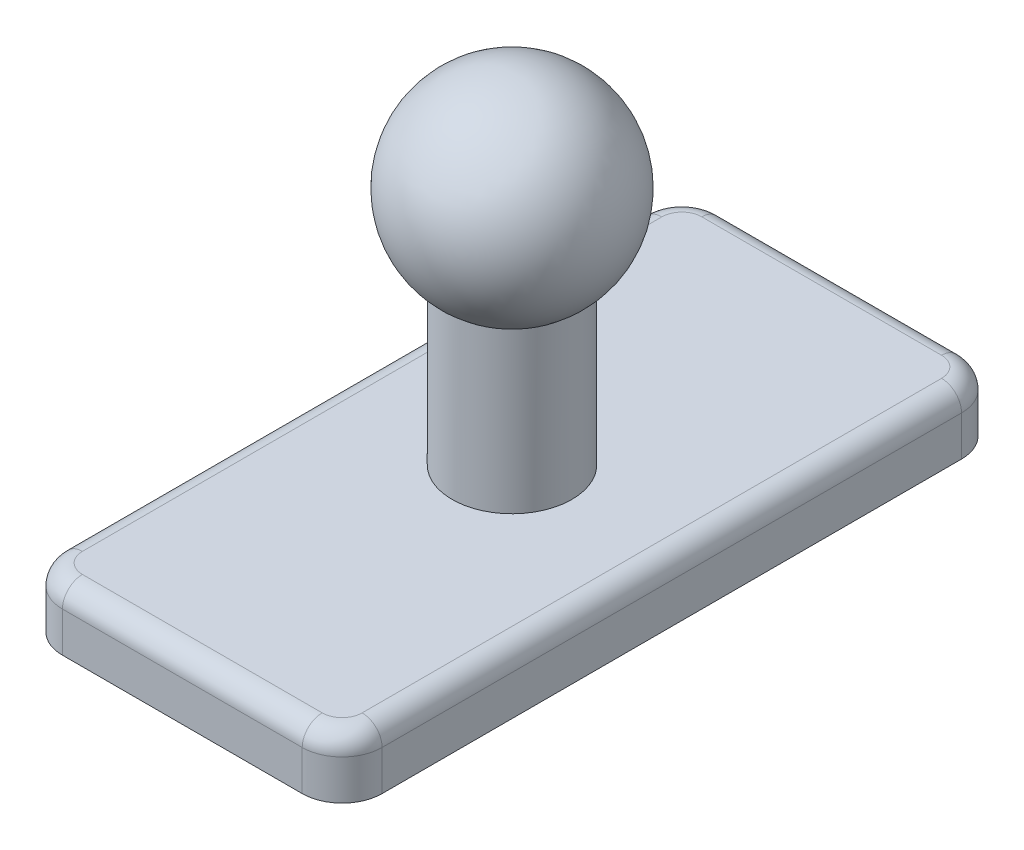
ISO-10303-21;
HEADER;
FILE_DESCRIPTION(('STEP AP214'),'2;1');
FILE_NAME('part.step','',(''),(''),'','','');
FILE_SCHEMA(('AUTOMOTIVE_DESIGN { 1 0 10303 214 1 1 1 1 }'));
ENDSEC;
DATA;
#1=APPLICATION_CONTEXT('core data for automotive mechanical design processes');
#2=APPLICATION_PROTOCOL_DEFINITION('international standard','automotive_design',2000,#1);
#3=PRODUCT_CONTEXT('',#1,'mechanical');
#4=PRODUCT('Part','Part','',(#3));
#5=PRODUCT_RELATED_PRODUCT_CATEGORY('part','',(#4));
#6=PRODUCT_DEFINITION_FORMATION('','',#4);
#7=PRODUCT_DEFINITION_CONTEXT('part definition',#1,'design');
#8=PRODUCT_DEFINITION('design','',#6,#7);
#9=PRODUCT_DEFINITION_SHAPE('','',#8);
#10=(LENGTH_UNIT() NAMED_UNIT(*) SI_UNIT(.MILLI.,.METRE.));
#11=(NAMED_UNIT(*) PLANE_ANGLE_UNIT() SI_UNIT($,.RADIAN.));
#12=(NAMED_UNIT(*) SI_UNIT($,.STERADIAN.) SOLID_ANGLE_UNIT());
#13=UNCERTAINTY_MEASURE_WITH_UNIT(LENGTH_MEASURE(1.E-05),#10,'distance_accuracy_value','');
#14=(GEOMETRIC_REPRESENTATION_CONTEXT(3) GLOBAL_UNCERTAINTY_ASSIGNED_CONTEXT((#13)) GLOBAL_UNIT_ASSIGNED_CONTEXT((#10,
#11,#12)) REPRESENTATION_CONTEXT('',''));
#15=CARTESIAN_POINT('',(0.,0.,0.));
#16=DIRECTION('',(0.,0.,1.));
#17=DIRECTION('',(1.,0.,0.));
#18=AXIS2_PLACEMENT_3D('',#15,#16,#17);
#19=CARTESIAN_POINT('',(-7.28498397727274,15.,21.5783811363636));
#20=DIRECTION('',(0.,-1.,0.));
#21=DIRECTION('',(0.,0.,-1.));
#22=AXIS2_PLACEMENT_3D('',#19,#20,#21);
#23=CYLINDRICAL_SURFACE('',#22,3.);
#24=CARTESIAN_POINT('',(-7.28498397727274,3.,21.5783811363636));
#25=DIRECTION('',(0.,-1.,0.));
#26=DIRECTION('',(0.,0.,-1.));
#27=AXIS2_PLACEMENT_3D('',#24,#25,#26);
#28=CIRCLE('',#27,3.);
#29=CARTESIAN_POINT('',(-7.28498397727274,3.,18.5783811363636));
#30=VERTEX_POINT('',#29);
#31=EDGE_CURVE('E44',#30,#30,#28,.F.);
#32=ORIENTED_EDGE('',*,*,#31,.T.);
#33=EDGE_LOOP('',(#32));
#34=FACE_BOUND('',#33,.T.);
#35=CARTESIAN_POINT('',(-7.28498397727274,11.,21.5783811363636));
#36=DIRECTION('',(0.,1.,0.));
#37=DIRECTION('',(0.,0.,1.));
#38=AXIS2_PLACEMENT_3D('',#35,#36,#37);
#39=CIRCLE('',#38,3.);
#40=CARTESIAN_POINT('',(-7.28498397727274,11.,24.5783811363636));
#41=VERTEX_POINT('',#40);
#42=EDGE_CURVE('E11',#41,#41,#39,.T.);
#43=ORIENTED_EDGE('',*,*,#42,.F.);
#44=EDGE_LOOP('',(#43));
#45=FACE_BOUND('',#44,.T.);
#46=ADVANCED_FACE('F35',(#34,#45),#23,.T.);
#47=CARTESIAN_POINT('',(-1.28498397727274,3.,7.07838113636365));
#48=DIRECTION('',(0.,-1.,0.));
#49=DIRECTION('',(0.,0.,-1.));
#50=AXIS2_PLACEMENT_3D('',#47,#48,#49);
#51=PLANE('',#50);
#52=DIRECTION('',(-1.,0.,0.));
#53=VECTOR('',#52,1.);
#54=CARTESIAN_POINT('',(-1.28498397727274,3.,6.07838113636365));
#55=LINE('',#54,#53);
#56=CARTESIAN_POINT('',(-1.28498397727276,3.,6.07838113636365));
#57=VERTEX_POINT('',#56);
#58=CARTESIAN_POINT('',(-13.2849839772727,3.,6.07838113636365));
#59=VERTEX_POINT('',#58);
#60=EDGE_CURVE('E199',#57,#59,#55,.T.);
#61=ORIENTED_EDGE('',*,*,#60,.T.);
#62=CARTESIAN_POINT('',(-13.2849839772727,3.,7.07838113636365));
#63=DIRECTION('',(0.,-1.,0.));
#64=DIRECTION('',(0.,0.,-1.));
#65=AXIS2_PLACEMENT_3D('',#62,#63,#64);
#66=CIRCLE('',#65,1.);
#67=CARTESIAN_POINT('',(-14.2849839772727,3.,7.07838113636366));
#68=VERTEX_POINT('',#67);
#69=EDGE_CURVE('E201',#59,#68,#66,.F.);
#70=ORIENTED_EDGE('',*,*,#69,.T.);
#71=DIRECTION('',(0.,0.,1.));
#72=VECTOR('',#71,1.);
#73=CARTESIAN_POINT('',(-14.2849839772727,3.,7.07838113636365));
#74=LINE('',#73,#72);
#75=CARTESIAN_POINT('',(-14.2849839772727,3.,36.0783811363636));
#76=VERTEX_POINT('',#75);
#77=EDGE_CURVE('E137',#68,#76,#74,.T.);
#78=ORIENTED_EDGE('',*,*,#77,.T.);
#79=CARTESIAN_POINT('',(-13.2849839772727,3.,36.0783811363636));
#80=DIRECTION('',(0.,-1.,0.));
#81=DIRECTION('',(0.,0.,-1.));
#82=AXIS2_PLACEMENT_3D('',#79,#80,#81);
#83=CIRCLE('',#82,1.);
#84=CARTESIAN_POINT('',(-13.2849839772727,3.,37.0783811363637));
#85=VERTEX_POINT('',#84);
#86=EDGE_CURVE('E189',#76,#85,#83,.F.);
#87=ORIENTED_EDGE('',*,*,#86,.T.);
#88=DIRECTION('',(1.,0.,0.));
#89=VECTOR('',#88,1.);
#90=CARTESIAN_POINT('',(-1.28498397727274,3.,37.0783811363637));
#91=LINE('',#90,#89);
#92=CARTESIAN_POINT('',(-1.28498397727273,3.,37.0783811363637));
#93=VERTEX_POINT('',#92);
#94=EDGE_CURVE('E191',#85,#93,#91,.T.);
#95=ORIENTED_EDGE('',*,*,#94,.T.);
#96=CARTESIAN_POINT('',(-1.28498397727272,3.,36.0783811363636));
#97=DIRECTION('',(0.,-1.,0.));
#98=DIRECTION('',(0.,0.,-1.));
#99=AXIS2_PLACEMENT_3D('',#96,#97,#98);
#100=CIRCLE('',#99,1.);
#101=CARTESIAN_POINT('',(-0.284983977272723,3.,36.0783811363636));
#102=VERTEX_POINT('',#101);
#103=EDGE_CURVE('E193',#93,#102,#100,.F.);
#104=ORIENTED_EDGE('',*,*,#103,.T.);
#105=DIRECTION('',(0.,0.,-1.));
#106=VECTOR('',#105,1.);
#107=CARTESIAN_POINT('',(-0.284983977272742,3.,7.07838113636365));
#108=LINE('',#107,#106);
#109=CARTESIAN_POINT('',(-0.284983977272742,3.,7.07838113636366));
#110=VERTEX_POINT('',#109);
#111=EDGE_CURVE('E195',#102,#110,#108,.T.);
#112=ORIENTED_EDGE('',*,*,#111,.T.);
#113=CARTESIAN_POINT('',(-1.28498397727274,3.,7.07838113636365));
#114=DIRECTION('',(0.,-1.,0.));
#115=DIRECTION('',(0.,0.,-1.));
#116=AXIS2_PLACEMENT_3D('',#113,#114,#115);
#117=CIRCLE('',#116,1.);
#118=EDGE_CURVE('E197',#110,#57,#117,.F.);
#119=ORIENTED_EDGE('',*,*,#118,.T.);
#120=EDGE_LOOP('',(#61,#70,#78,#87,#95,#104,#112,#119));
#121=FACE_BOUND('',#120,.T.);
#122=ORIENTED_EDGE('',*,*,#31,.F.);
#123=EDGE_LOOP('',(#122));
#124=FACE_BOUND('',#123,.T.);
#125=ADVANCED_FACE('F240',(#121,#124),#51,.F.);
#126=CARTESIAN_POINT('',(-1.28498397727274,3.,7.07838113636365));
#127=DIRECTION('',(0.,-1.,0.));
#128=DIRECTION('',(0.,0.,-1.));
#129=AXIS2_PLACEMENT_3D('',#126,#127,#128);
#130=CYLINDRICAL_SURFACE('',#129,2.);
#131=DIRECTION('',(0.,-1.,0.));
#132=VECTOR('',#131,1.);
#133=CARTESIAN_POINT('',(-1.28498397727276,3.,5.07838113636365));
#134=LINE('',#133,#132);
#135=CARTESIAN_POINT('',(-1.28498397727276,2.,5.07838113636365));
#136=VERTEX_POINT('',#135);
#137=CARTESIAN_POINT('',(-1.28498397727276,0.,5.07838113636365));
#138=VERTEX_POINT('',#137);
#139=EDGE_CURVE('E126',#136,#138,#134,.T.);
#140=ORIENTED_EDGE('',*,*,#139,.F.);
#141=CARTESIAN_POINT('',(-1.28498397727274,2.,7.07838113636365));
#142=DIRECTION('',(0.,-1.,0.));
#143=DIRECTION('',(0.,0.,-1.));
#144=AXIS2_PLACEMENT_3D('',#141,#142,#143);
#145=CIRCLE('',#144,2.);
#146=CARTESIAN_POINT('',(0.715016022727258,2.,7.07838113636366));
#147=VERTEX_POINT('',#146);
#148=EDGE_CURVE('E208',#136,#147,#145,.T.);
#149=ORIENTED_EDGE('',*,*,#148,.T.);
#150=DIRECTION('',(0.,-1.,0.));
#151=VECTOR('',#150,1.);
#152=CARTESIAN_POINT('',(0.715016022727258,3.,7.07838113636366));
#153=LINE('',#152,#151);
#154=CARTESIAN_POINT('',(0.715016022727258,0.,7.07838113636366));
#155=VERTEX_POINT('',#154);
#156=EDGE_CURVE('E151',#147,#155,#153,.T.);
#157=ORIENTED_EDGE('',*,*,#156,.T.);
#158=CARTESIAN_POINT('',(-1.28498397727274,0.,7.07838113636365));
#159=DIRECTION('',(0.,1.,0.));
#160=DIRECTION('',(0.,0.,-1.));
#161=AXIS2_PLACEMENT_3D('',#158,#159,#160);
#162=CIRCLE('',#161,2.);
#163=EDGE_CURVE('E144',#155,#138,#162,.T.);
#164=ORIENTED_EDGE('',*,*,#163,.T.);
#165=EDGE_LOOP('',(#140,#149,#157,#164));
#166=FACE_BOUND('',#165,.T.);
#167=ADVANCED_FACE('F149',(#166),#130,.T.);
#168=CARTESIAN_POINT('',(-13.2849839772727,3.,5.07838113636365));
#169=DIRECTION('',(0.,0.,1.));
#170=DIRECTION('',(1.,0.,0.));
#171=AXIS2_PLACEMENT_3D('',#168,#169,#170);
#172=PLANE('',#171);
#173=DIRECTION('',(0.,-1.,0.));
#174=VECTOR('',#173,1.);
#175=CARTESIAN_POINT('',(-13.2849839772727,3.,5.07838113636365));
#176=LINE('',#175,#174);
#177=CARTESIAN_POINT('',(-13.2849839772727,2.,5.07838113636365));
#178=VERTEX_POINT('',#177);
#179=CARTESIAN_POINT('',(-13.2849839772727,0.,5.07838113636365));
#180=VERTEX_POINT('',#179);
#181=EDGE_CURVE('E138',#178,#180,#176,.T.);
#182=ORIENTED_EDGE('',*,*,#181,.F.);
#183=DIRECTION('',(-1.,0.,0.));
#184=VECTOR('',#183,1.);
#185=CARTESIAN_POINT('',(-13.2849839772727,2.,5.07838113636365));
#186=LINE('',#185,#184);
#187=EDGE_CURVE('E133',#178,#136,#186,.F.);
#188=ORIENTED_EDGE('',*,*,#187,.T.);
#189=ORIENTED_EDGE('',*,*,#139,.T.);
#190=DIRECTION('',(-1.,0.,0.));
#191=VECTOR('',#190,1.);
#192=CARTESIAN_POINT('',(-13.2849839772727,0.,5.07838113636365));
#193=LINE('',#192,#191);
#194=EDGE_CURVE('E130',#138,#180,#193,.T.);
#195=ORIENTED_EDGE('',*,*,#194,.T.);
#196=EDGE_LOOP('',(#182,#188,#189,#195));
#197=FACE_BOUND('',#196,.T.);
#198=ADVANCED_FACE('F129',(#197),#172,.F.);
#199=CARTESIAN_POINT('',(-13.2849839772727,3.,7.07838113636365));
#200=DIRECTION('',(0.,-1.,0.));
#201=DIRECTION('',(0.,0.,-1.));
#202=AXIS2_PLACEMENT_3D('',#199,#200,#201);
#203=CYLINDRICAL_SURFACE('',#202,2.);
#204=DIRECTION('',(0.,-1.,0.));
#205=VECTOR('',#204,1.);
#206=CARTESIAN_POINT('',(-15.2849839772727,3.,7.07838113636366));
#207=LINE('',#206,#205);
#208=CARTESIAN_POINT('',(-15.2849839772727,2.,7.07838113636366));
#209=VERTEX_POINT('',#208);
#210=CARTESIAN_POINT('',(-15.2849839772727,0.,7.07838113636366));
#211=VERTEX_POINT('',#210);
#212=EDGE_CURVE('E185',#209,#211,#207,.T.);
#213=ORIENTED_EDGE('',*,*,#212,.F.);
#214=CARTESIAN_POINT('',(-13.2849839772727,2.,7.07838113636365));
#215=DIRECTION('',(0.,-1.,0.));
#216=DIRECTION('',(0.,0.,-1.));
#217=AXIS2_PLACEMENT_3D('',#214,#215,#216);
#218=CIRCLE('',#217,2.);
#219=EDGE_CURVE('E204',#209,#178,#218,.T.);
#220=ORIENTED_EDGE('',*,*,#219,.T.);
#221=ORIENTED_EDGE('',*,*,#181,.T.);
#222=CARTESIAN_POINT('',(-13.2849839772727,0.,7.07838113636365));
#223=DIRECTION('',(0.,1.,0.));
#224=DIRECTION('',(0.,0.,1.));
#225=AXIS2_PLACEMENT_3D('',#222,#223,#224);
#226=CIRCLE('',#225,2.);
#227=EDGE_CURVE('E147',#180,#211,#226,.T.);
#228=ORIENTED_EDGE('',*,*,#227,.T.);
#229=EDGE_LOOP('',(#213,#220,#221,#228));
#230=FACE_BOUND('',#229,.T.);
#231=ADVANCED_FACE('F271',(#230),#203,.T.);
#232=CARTESIAN_POINT('',(-15.2849839772727,3.,7.07838113636366));
#233=DIRECTION('',(1.,0.,0.));
#234=DIRECTION('',(0.,0.,-1.));
#235=AXIS2_PLACEMENT_3D('',#232,#233,#234);
#236=PLANE('',#235);
#237=DIRECTION('',(0.,-1.,0.));
#238=VECTOR('',#237,1.);
#239=CARTESIAN_POINT('',(-15.2849839772727,3.,36.0783811363636));
#240=LINE('',#239,#238);
#241=CARTESIAN_POINT('',(-15.2849839772727,2.,36.0783811363636));
#242=VERTEX_POINT('',#241);
#243=CARTESIAN_POINT('',(-15.2849839772727,0.,36.0783811363636));
#244=VERTEX_POINT('',#243);
#245=EDGE_CURVE('E183',#242,#244,#240,.T.);
#246=ORIENTED_EDGE('',*,*,#245,.F.);
#247=DIRECTION('',(0.,0.,1.));
#248=VECTOR('',#247,1.);
#249=CARTESIAN_POINT('',(-15.2849839772727,2.,7.07838113636366));
#250=LINE('',#249,#248);
#251=EDGE_CURVE('E216',#242,#209,#250,.F.);
#252=ORIENTED_EDGE('',*,*,#251,.T.);
#253=ORIENTED_EDGE('',*,*,#212,.T.);
#254=DIRECTION('',(0.,0.,1.));
#255=VECTOR('',#254,1.);
#256=CARTESIAN_POINT('',(-15.2849839772727,0.,7.07838113636366));
#257=LINE('',#256,#255);
#258=EDGE_CURVE('E162',#211,#244,#257,.T.);
#259=ORIENTED_EDGE('',*,*,#258,.T.);
#260=EDGE_LOOP('',(#246,#252,#253,#259));
#261=FACE_BOUND('',#260,.T.);
#262=ADVANCED_FACE('F268',(#261),#236,.F.);
#263=CARTESIAN_POINT('',(-13.2849839772727,3.,36.0783811363636));
#264=DIRECTION('',(0.,-1.,0.));
#265=DIRECTION('',(0.,0.,-1.));
#266=AXIS2_PLACEMENT_3D('',#263,#264,#265);
#267=CYLINDRICAL_SURFACE('',#266,2.);
#268=DIRECTION('',(0.,-1.,0.));
#269=VECTOR('',#268,1.);
#270=CARTESIAN_POINT('',(-13.2849839772727,3.,38.0783811363637));
#271=LINE('',#270,#269);
#272=CARTESIAN_POINT('',(-13.2849839772727,2.,38.0783811363637));
#273=VERTEX_POINT('',#272);
#274=CARTESIAN_POINT('',(-13.2849839772727,0.,38.0783811363637));
#275=VERTEX_POINT('',#274);
#276=EDGE_CURVE('E181',#273,#275,#271,.T.);
#277=ORIENTED_EDGE('',*,*,#276,.F.);
#278=CARTESIAN_POINT('',(-13.2849839772727,2.,36.0783811363636));
#279=DIRECTION('',(0.,-1.,0.));
#280=DIRECTION('',(0.,0.,-1.));
#281=AXIS2_PLACEMENT_3D('',#278,#279,#280);
#282=CIRCLE('',#281,2.);
#283=EDGE_CURVE('E51',#273,#242,#282,.T.);
#284=ORIENTED_EDGE('',*,*,#283,.T.);
#285=ORIENTED_EDGE('',*,*,#245,.T.);
#286=CARTESIAN_POINT('',(-13.2849839772727,0.,36.0783811363636));
#287=DIRECTION('',(0.,1.,0.));
#288=DIRECTION('',(0.,0.,1.));
#289=AXIS2_PLACEMENT_3D('',#286,#287,#288);
#290=CIRCLE('',#289,2.);
#291=EDGE_CURVE('E165',#244,#275,#290,.T.);
#292=ORIENTED_EDGE('',*,*,#291,.T.);
#293=EDGE_LOOP('',(#277,#284,#285,#292));
#294=FACE_BOUND('',#293,.T.);
#295=ADVANCED_FACE('F265',(#294),#267,.T.);
#296=CARTESIAN_POINT('',(-13.2849839772727,3.,38.0783811363637));
#297=DIRECTION('',(0.,0.,-1.));
#298=DIRECTION('',(-1.,0.,0.));
#299=AXIS2_PLACEMENT_3D('',#296,#297,#298);
#300=PLANE('',#299);
#301=DIRECTION('',(0.,-1.,0.));
#302=VECTOR('',#301,1.);
#303=CARTESIAN_POINT('',(-1.28498397727274,3.,38.0783811363637));
#304=LINE('',#303,#302);
#305=CARTESIAN_POINT('',(-1.28498397727274,2.,38.0783811363637));
#306=VERTEX_POINT('',#305);
#307=CARTESIAN_POINT('',(-1.28498397727274,0.,38.0783811363637));
#308=VERTEX_POINT('',#307);
#309=EDGE_CURVE('E179',#306,#308,#304,.T.);
#310=ORIENTED_EDGE('',*,*,#309,.F.);
#311=DIRECTION('',(1.,0.,0.));
#312=VECTOR('',#311,1.);
#313=CARTESIAN_POINT('',(-13.2849839772727,2.,38.0783811363637));
#314=LINE('',#313,#312);
#315=EDGE_CURVE('E59',#306,#273,#314,.F.);
#316=ORIENTED_EDGE('',*,*,#315,.T.);
#317=ORIENTED_EDGE('',*,*,#276,.T.);
#318=DIRECTION('',(1.,0.,0.));
#319=VECTOR('',#318,1.);
#320=CARTESIAN_POINT('',(-13.2849839772727,0.,38.0783811363637));
#321=LINE('',#320,#319);
#322=EDGE_CURVE('E168',#275,#308,#321,.T.);
#323=ORIENTED_EDGE('',*,*,#322,.T.);
#324=EDGE_LOOP('',(#310,#316,#317,#323));
#325=FACE_BOUND('',#324,.T.);
#326=ADVANCED_FACE('F261',(#325),#300,.F.);
#327=CARTESIAN_POINT('',(-1.28498397727272,3.,36.0783811363636));
#328=DIRECTION('',(0.,-1.,0.));
#329=DIRECTION('',(0.,0.,-1.));
#330=AXIS2_PLACEMENT_3D('',#327,#328,#329);
#331=CYLINDRICAL_SURFACE('',#330,2.);
#332=DIRECTION('',(0.,-1.,0.));
#333=VECTOR('',#332,1.);
#334=CARTESIAN_POINT('',(0.715016022727277,3.,36.0783811363636));
#335=LINE('',#334,#333);
#336=CARTESIAN_POINT('',(0.715016022727277,2.,36.0783811363636));
#337=VERTEX_POINT('',#336);
#338=CARTESIAN_POINT('',(0.715016022727277,0.,36.0783811363636));
#339=VERTEX_POINT('',#338);
#340=EDGE_CURVE('E177',#337,#339,#335,.T.);
#341=ORIENTED_EDGE('',*,*,#340,.F.);
#342=CARTESIAN_POINT('',(-1.28498397727272,2.,36.0783811363636));
#343=DIRECTION('',(0.,-1.,0.));
#344=DIRECTION('',(0.,0.,-1.));
#345=AXIS2_PLACEMENT_3D('',#342,#343,#344);
#346=CIRCLE('',#345,2.);
#347=EDGE_CURVE('E212',#337,#306,#346,.T.);
#348=ORIENTED_EDGE('',*,*,#347,.T.);
#349=ORIENTED_EDGE('',*,*,#309,.T.);
#350=CARTESIAN_POINT('',(-1.28498397727272,0.,36.0783811363636));
#351=DIRECTION('',(0.,1.,0.));
#352=DIRECTION('',(0.,0.,1.));
#353=AXIS2_PLACEMENT_3D('',#350,#351,#352);
#354=CIRCLE('',#353,2.);
#355=EDGE_CURVE('E171',#308,#339,#354,.T.);
#356=ORIENTED_EDGE('',*,*,#355,.T.);
#357=EDGE_LOOP('',(#341,#348,#349,#356));
#358=FACE_BOUND('',#357,.T.);
#359=ADVANCED_FACE('F257',(#358),#331,.T.);
#360=CARTESIAN_POINT('',(0.715016022727258,3.,7.07838113636366));
#361=DIRECTION('',(-1.,0.,0.));
#362=DIRECTION('',(0.,0.,1.));
#363=AXIS2_PLACEMENT_3D('',#360,#361,#362);
#364=PLANE('',#363);
#365=ORIENTED_EDGE('',*,*,#156,.F.);
#366=DIRECTION('',(0.,0.,-1.));
#367=VECTOR('',#366,1.);
#368=CARTESIAN_POINT('',(0.715016022727258,2.,7.07838113636366));
#369=LINE('',#368,#367);
#370=EDGE_CURVE('E210',#147,#337,#369,.F.);
#371=ORIENTED_EDGE('',*,*,#370,.T.);
#372=ORIENTED_EDGE('',*,*,#340,.T.);
#373=DIRECTION('',(0.,0.,-1.));
#374=VECTOR('',#373,1.);
#375=CARTESIAN_POINT('',(0.715016022727258,0.,7.07838113636366));
#376=LINE('',#375,#374);
#377=EDGE_CURVE('E174',#339,#155,#376,.T.);
#378=ORIENTED_EDGE('',*,*,#377,.T.);
#379=EDGE_LOOP('',(#365,#371,#372,#378));
#380=FACE_BOUND('',#379,.T.);
#381=ADVANCED_FACE('F254',(#380),#364,.F.);
#382=CARTESIAN_POINT('',(-1.28498397727274,0.,7.07838113636365));
#383=DIRECTION('',(0.,-1.,0.));
#384=DIRECTION('',(0.,0.,-1.));
#385=AXIS2_PLACEMENT_3D('',#382,#383,#384);
#386=PLANE('',#385);
#387=ORIENTED_EDGE('',*,*,#163,.F.);
#388=ORIENTED_EDGE('',*,*,#377,.F.);
#389=ORIENTED_EDGE('',*,*,#355,.F.);
#390=ORIENTED_EDGE('',*,*,#322,.F.);
#391=ORIENTED_EDGE('',*,*,#291,.F.);
#392=ORIENTED_EDGE('',*,*,#258,.F.);
#393=ORIENTED_EDGE('',*,*,#227,.F.);
#394=ORIENTED_EDGE('',*,*,#194,.F.);
#395=EDGE_LOOP('',(#387,#388,#389,#390,#391,#392,#393,#394));
#396=FACE_BOUND('',#395,.T.);
#397=ADVANCED_FACE('F142',(#396),#386,.T.);
#398=CARTESIAN_POINT('',(-1.28498397727272,2.,36.0783811363636));
#399=DIRECTION('',(0.,-1.,0.));
#400=DIRECTION('',(0.,0.,-1.));
#401=AXIS2_PLACEMENT_3D('',#398,#399,#400);
#402=TOROIDAL_SURFACE('',#401,1.,1.);
#403=CARTESIAN_POINT('',(-1.28498397727273,2.,37.0783811363637));
#404=DIRECTION('',(-1.,0.,0.));
#405=DIRECTION('',(0.,0.,1.));
#406=AXIS2_PLACEMENT_3D('',#403,#404,#405);
#407=CIRCLE('',#406,1.);
#408=EDGE_CURVE('E156',#306,#93,#407,.T.);
#409=ORIENTED_EDGE('',*,*,#408,.F.);
#410=ORIENTED_EDGE('',*,*,#347,.F.);
#411=CARTESIAN_POINT('',(-0.284983977272723,2.,36.0783811363636));
#412=DIRECTION('',(0.,0.,-1.));
#413=DIRECTION('',(-1.,0.,0.));
#414=AXIS2_PLACEMENT_3D('',#411,#412,#413);
#415=CIRCLE('',#414,1.);
#416=EDGE_CURVE('E153',#102,#337,#415,.T.);
#417=ORIENTED_EDGE('',*,*,#416,.F.);
#418=ORIENTED_EDGE('',*,*,#103,.F.);
#419=EDGE_LOOP('',(#409,#410,#417,#418));
#420=FACE_BOUND('',#419,.T.);
#421=ADVANCED_FACE('F37',(#420),#402,.T.);
#422=CARTESIAN_POINT('',(-0.284983977272742,2.,7.07838113636365));
#423=DIRECTION('',(0.,0.,-1.));
#424=DIRECTION('',(-1.,0.,0.));
#425=AXIS2_PLACEMENT_3D('',#422,#423,#424);
#426=CYLINDRICAL_SURFACE('',#425,1.);
#427=ORIENTED_EDGE('',*,*,#416,.T.);
#428=ORIENTED_EDGE('',*,*,#370,.F.);
#429=CARTESIAN_POINT('',(-0.284983977272742,2.,7.07838113636366));
#430=DIRECTION('',(0.,0.,-1.));
#431=DIRECTION('',(-1.,0.,0.));
#432=AXIS2_PLACEMENT_3D('',#429,#430,#431);
#433=CIRCLE('',#432,1.);
#434=EDGE_CURVE('E231',#110,#147,#433,.T.);
#435=ORIENTED_EDGE('',*,*,#434,.F.);
#436=ORIENTED_EDGE('',*,*,#111,.F.);
#437=EDGE_LOOP('',(#427,#428,#435,#436));
#438=FACE_BOUND('',#437,.T.);
#439=ADVANCED_FACE('F301',(#438),#426,.T.);
#440=CARTESIAN_POINT('',(-1.28498397727274,2.,37.0783811363637));
#441=DIRECTION('',(1.,0.,0.));
#442=DIRECTION('',(0.,0.,-1.));
#443=AXIS2_PLACEMENT_3D('',#440,#441,#442);
#444=CYLINDRICAL_SURFACE('',#443,1.);
#445=ORIENTED_EDGE('',*,*,#408,.T.);
#446=ORIENTED_EDGE('',*,*,#94,.F.);
#447=CARTESIAN_POINT('',(-13.2849839772727,2.,37.0783811363637));
#448=DIRECTION('',(-1.,0.,0.));
#449=DIRECTION('',(0.,0.,1.));
#450=AXIS2_PLACEMENT_3D('',#447,#448,#449);
#451=CIRCLE('',#450,1.);
#452=EDGE_CURVE('E228',#273,#85,#451,.T.);
#453=ORIENTED_EDGE('',*,*,#452,.F.);
#454=ORIENTED_EDGE('',*,*,#315,.F.);
#455=EDGE_LOOP('',(#445,#446,#453,#454));
#456=FACE_BOUND('',#455,.T.);
#457=ADVANCED_FACE('F298',(#456),#444,.T.);
#458=CARTESIAN_POINT('',(-1.28498397727274,2.,7.07838113636365));
#459=DIRECTION('',(0.,-1.,0.));
#460=DIRECTION('',(0.,0.,-1.));
#461=AXIS2_PLACEMENT_3D('',#458,#459,#460);
#462=DEGENERATE_TOROIDAL_SURFACE('',#461,1.,1.,.T.);
#463=ORIENTED_EDGE('',*,*,#434,.T.);
#464=ORIENTED_EDGE('',*,*,#148,.F.);
#465=CARTESIAN_POINT('',(-1.28498397727276,2.,6.07838113636365));
#466=DIRECTION('',(-1.,0.,0.));
#467=DIRECTION('',(0.,0.,1.));
#468=AXIS2_PLACEMENT_3D('',#465,#466,#467);
#469=CIRCLE('',#468,1.);
#470=EDGE_CURVE('E225',#57,#136,#469,.T.);
#471=ORIENTED_EDGE('',*,*,#470,.F.);
#472=ORIENTED_EDGE('',*,*,#118,.F.);
#473=EDGE_LOOP('',(#463,#464,#471,#472));
#474=FACE_BOUND('',#473,.T.);
#475=ADVANCED_FACE('F294',(#474),#462,.T.);
#476=CARTESIAN_POINT('',(-13.2849839772727,2.,36.0783811363636));
#477=DIRECTION('',(0.,-1.,0.));
#478=DIRECTION('',(0.,0.,-1.));
#479=AXIS2_PLACEMENT_3D('',#476,#477,#478);
#480=TOROIDAL_SURFACE('',#479,1.,1.);
#481=ORIENTED_EDGE('',*,*,#452,.T.);
#482=ORIENTED_EDGE('',*,*,#86,.F.);
#483=CARTESIAN_POINT('',(-14.2849839772727,2.,36.0783811363636));
#484=DIRECTION('',(0.,0.,-1.));
#485=DIRECTION('',(-1.,0.,0.));
#486=AXIS2_PLACEMENT_3D('',#483,#484,#485);
#487=CIRCLE('',#486,1.);
#488=EDGE_CURVE('E222',#242,#76,#487,.T.);
#489=ORIENTED_EDGE('',*,*,#488,.F.);
#490=ORIENTED_EDGE('',*,*,#283,.F.);
#491=EDGE_LOOP('',(#481,#482,#489,#490));
#492=FACE_BOUND('',#491,.T.);
#493=ADVANCED_FACE('F290',(#492),#480,.T.);
#494=CARTESIAN_POINT('',(-1.28498397727274,2.,6.07838113636365));
#495=DIRECTION('',(-1.,0.,0.));
#496=DIRECTION('',(0.,0.,1.));
#497=AXIS2_PLACEMENT_3D('',#494,#495,#496);
#498=CYLINDRICAL_SURFACE('',#497,1.);
#499=ORIENTED_EDGE('',*,*,#470,.T.);
#500=ORIENTED_EDGE('',*,*,#187,.F.);
#501=CARTESIAN_POINT('',(-13.2849839772727,2.,6.07838113636365));
#502=DIRECTION('',(-1.,0.,0.));
#503=DIRECTION('',(0.,0.,1.));
#504=AXIS2_PLACEMENT_3D('',#501,#502,#503);
#505=CIRCLE('',#504,1.);
#506=EDGE_CURVE('E220',#59,#178,#505,.T.);
#507=ORIENTED_EDGE('',*,*,#506,.F.);
#508=ORIENTED_EDGE('',*,*,#60,.F.);
#509=EDGE_LOOP('',(#499,#500,#507,#508));
#510=FACE_BOUND('',#509,.T.);
#511=ADVANCED_FACE('F286',(#510),#498,.T.);
#512=CARTESIAN_POINT('',(-14.2849839772727,2.,7.07838113636365));
#513=DIRECTION('',(0.,0.,1.));
#514=DIRECTION('',(1.,0.,0.));
#515=AXIS2_PLACEMENT_3D('',#512,#513,#514);
#516=CYLINDRICAL_SURFACE('',#515,1.);
#517=ORIENTED_EDGE('',*,*,#488,.T.);
#518=ORIENTED_EDGE('',*,*,#77,.F.);
#519=CARTESIAN_POINT('',(-14.2849839772727,2.,7.07838113636366));
#520=DIRECTION('',(0.,0.,-1.));
#521=DIRECTION('',(0.,1.,0.));
#522=AXIS2_PLACEMENT_3D('',#519,#520,#521);
#523=CIRCLE('',#522,1.);
#524=EDGE_CURVE('E218',#209,#68,#523,.T.);
#525=ORIENTED_EDGE('',*,*,#524,.F.);
#526=ORIENTED_EDGE('',*,*,#251,.F.);
#527=EDGE_LOOP('',(#517,#518,#525,#526));
#528=FACE_BOUND('',#527,.T.);
#529=ADVANCED_FACE('F282',(#528),#516,.T.);
#530=CARTESIAN_POINT('',(-13.2849839772727,2.,7.07838113636365));
#531=DIRECTION('',(0.,-1.,0.));
#532=DIRECTION('',(0.,0.,-1.));
#533=AXIS2_PLACEMENT_3D('',#530,#531,#532);
#534=DEGENERATE_TOROIDAL_SURFACE('',#533,1.,1.,.T.);
#535=ORIENTED_EDGE('',*,*,#506,.T.);
#536=ORIENTED_EDGE('',*,*,#219,.F.);
#537=ORIENTED_EDGE('',*,*,#524,.T.);
#538=ORIENTED_EDGE('',*,*,#69,.F.);
#539=EDGE_LOOP('',(#535,#536,#537,#538));
#540=FACE_BOUND('',#539,.T.);
#541=ADVANCED_FACE('F278',(#540),#534,.T.);
#542=CARTESIAN_POINT('',(-7.28498397727274,15.,21.5783811363636));
#543=DIRECTION('',(0.,0.,-1.));
#544=DIRECTION('',(1.,0.,0.));
#545=AXIS2_PLACEMENT_3D('',#542,#543,#544);
#546=SPHERICAL_SURFACE('',#545,5.);
#547=CARTESIAN_POINT('',(-7.28498397727274,15.,21.5783811363636));
#548=DIRECTION('',(0.,1.,0.));
#549=DIRECTION('',(0.,0.,1.));
#550=AXIS2_PLACEMENT_3D('',#547,#548,#549);
#551=SPHERICAL_SURFACE('',#550,5.);
#552=ORIENTED_EDGE('',*,*,#42,.T.);
#553=EDGE_LOOP('',(#552));
#554=FACE_BOUND('',#553,.T.);
#555=ADVANCED_FACE('F281',(#554),#551,.T.);
#556=CLOSED_SHELL('',(#46,#125,#167,#198,#231,#262,#295,#326,#359,#381,#397,#421,#439,#457,#475,
#493,#511,#529,#541,#555));
#557=CARTESIAN_POINT('',(-7.28498397727274,15.,21.5783811363636));
#558=DIRECTION('',(0.,0.,-1.));
#559=DIRECTION('',(-1.,0.,0.));
#560=AXIS2_PLACEMENT_3D('',#557,#558,#559);
#561=SPHERICAL_SURFACE('',#560,3.);
#562=CARTESIAN_POINT('',(-7.28498397727274,15.,21.5783811363636));
#563=DIRECTION('',(0.,1.,0.));
#564=DIRECTION('',(0.,0.,1.));
#565=AXIS2_PLACEMENT_3D('',#562,#563,#564);
#566=SPHERICAL_SURFACE('',#565,3.);
#567=CARTESIAN_POINT('',(-7.28498397727274,15.,21.5783811363636));
#568=DIRECTION('',(0.,1.,0.));
#569=DIRECTION('',(0.,0.,1.));
#570=AXIS2_PLACEMENT_3D('',#567,#568,#569);
#571=CIRCLE('',#570,3.);
#572=CARTESIAN_POINT('',(-7.28498397727274,15.,24.5783811363636));
#573=VERTEX_POINT('',#572);
#574=EDGE_CURVE('E159',#573,#573,#571,.F.);
#575=ORIENTED_EDGE('',*,*,#574,.T.);
#576=EDGE_LOOP('',(#575));
#577=FACE_BOUND('',#576,.T.);
#578=ADVANCED_FACE('F439',(#577),#566,.F.);
#579=CARTESIAN_POINT('',(-7.28498397727274,15.,21.5783811363636));
#580=DIRECTION('',(0.,1.,0.));
#581=DIRECTION('',(0.,0.,1.));
#582=AXIS2_PLACEMENT_3D('',#579,#580,#581);
#583=PLANE('',#582);
#584=ORIENTED_EDGE('',*,*,#574,.F.);
#585=EDGE_LOOP('',(#584));
#586=FACE_BOUND('',#585,.T.);
#587=ADVANCED_FACE('F434',(#586),#583,.T.);
#588=CLOSED_SHELL('',(#578,#587));
#589=ORIENTED_CLOSED_SHELL('',*,#588,.T.);
#590=BREP_WITH_VOIDS('B2',#556,(#589));
#591=ADVANCED_BREP_SHAPE_REPRESENTATION('',(#18,#590),#14);
#592=SHAPE_DEFINITION_REPRESENTATION(#9,#591);
ENDSEC;
END-ISO-10303-21;
